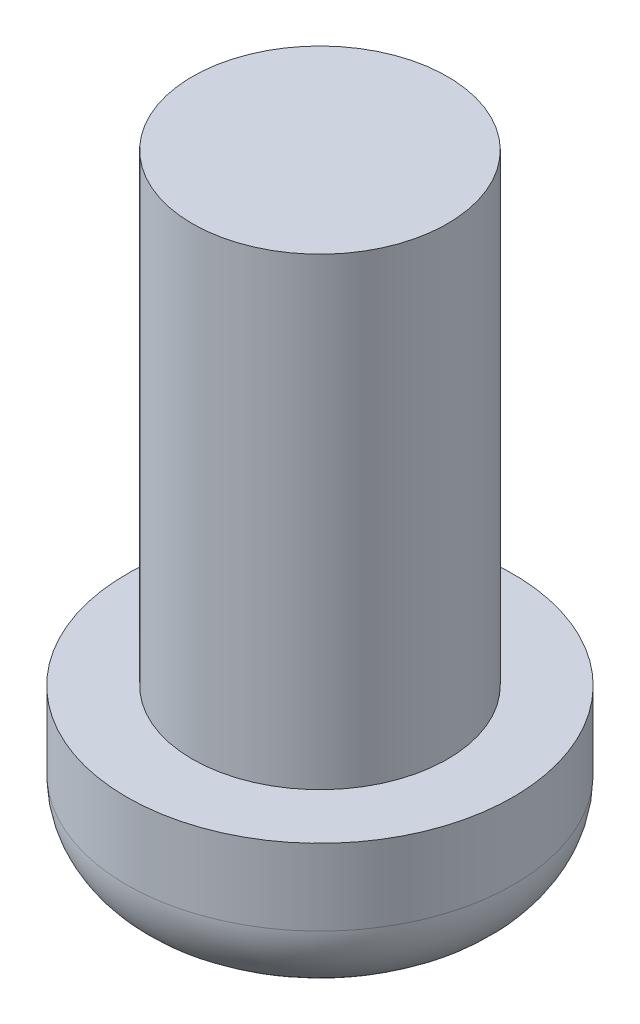
ISO-10303-21;
HEADER;
FILE_DESCRIPTION(('STEP AP214'),'2;1');
FILE_NAME('part.step','',(''),(''),'','','');
FILE_SCHEMA(('AUTOMOTIVE_DESIGN { 1 0 10303 214 1 1 1 1 }'));
ENDSEC;
DATA;
#1=APPLICATION_CONTEXT('core data for automotive mechanical design processes');
#2=APPLICATION_PROTOCOL_DEFINITION('international standard','automotive_design',2000,#1);
#3=PRODUCT_CONTEXT('',#1,'mechanical');
#4=PRODUCT('Part','Part','',(#3));
#5=PRODUCT_RELATED_PRODUCT_CATEGORY('part','',(#4));
#6=PRODUCT_DEFINITION_FORMATION('','',#4);
#7=PRODUCT_DEFINITION_CONTEXT('part definition',#1,'design');
#8=PRODUCT_DEFINITION('design','',#6,#7);
#9=PRODUCT_DEFINITION_SHAPE('','',#8);
#10=(LENGTH_UNIT() NAMED_UNIT(*) SI_UNIT(.MILLI.,.METRE.));
#11=(NAMED_UNIT(*) PLANE_ANGLE_UNIT() SI_UNIT($,.RADIAN.));
#12=(NAMED_UNIT(*) SI_UNIT($,.STERADIAN.) SOLID_ANGLE_UNIT());
#13=UNCERTAINTY_MEASURE_WITH_UNIT(LENGTH_MEASURE(1.E-05),#10,'distance_accuracy_value','');
#14=(GEOMETRIC_REPRESENTATION_CONTEXT(3) GLOBAL_UNCERTAINTY_ASSIGNED_CONTEXT((#13)) GLOBAL_UNIT_ASSIGNED_CONTEXT((#10,
#11,#12)) REPRESENTATION_CONTEXT('',''));
#15=CARTESIAN_POINT('',(0.,0.,0.));
#16=DIRECTION('',(0.,0.,1.));
#17=DIRECTION('',(1.,0.,0.));
#18=AXIS2_PLACEMENT_3D('',#15,#16,#17);
#19=CARTESIAN_POINT('',(0.,2.,0.));
#20=DIRECTION('',(0.,-1.,0.));
#21=DIRECTION('',(0.,0.,-1.));
#22=AXIS2_PLACEMENT_3D('',#19,#20,#21);
#23=CYLINDRICAL_SURFACE('',#22,2.5);
#24=CARTESIAN_POINT('',(0.,1.016,0.));
#25=DIRECTION('',(0.,1.,0.));
#26=DIRECTION('',(0.,0.,1.));
#27=AXIS2_PLACEMENT_3D('',#24,#25,#26);
#28=CIRCLE('',#27,2.5);
#29=CARTESIAN_POINT('',(0.,1.016,2.5));
#30=VERTEX_POINT('',#29);
#31=EDGE_CURVE('E44',#30,#30,#28,.T.);
#32=ORIENTED_EDGE('',*,*,#31,.T.);
#33=EDGE_LOOP('',(#32));
#34=FACE_BOUND('',#33,.T.);
#35=CARTESIAN_POINT('',(0.,2.,0.));
#36=DIRECTION('',(0.,1.,0.));
#37=DIRECTION('',(0.,0.,1.));
#38=AXIS2_PLACEMENT_3D('',#35,#36,#37);
#39=CIRCLE('',#38,2.5);
#40=CARTESIAN_POINT('',(0.,2.,2.5));
#41=VERTEX_POINT('',#40);
#42=EDGE_CURVE('E54',#41,#41,#39,.T.);
#43=ORIENTED_EDGE('',*,*,#42,.F.);
#44=EDGE_LOOP('',(#43));
#45=FACE_BOUND('',#44,.T.);
#46=ADVANCED_FACE('F36',(#34,#45),#23,.T.);
#47=CARTESIAN_POINT('',(0.,2.,0.));
#48=DIRECTION('',(0.,1.,0.));
#49=DIRECTION('',(0.,0.,1.));
#50=AXIS2_PLACEMENT_3D('',#47,#48,#49);
#51=PLANE('',#50);
#52=CARTESIAN_POINT('',(0.,2.,0.));
#53=DIRECTION('',(0.,1.,0.));
#54=DIRECTION('',(0.,0.,1.));
#55=AXIS2_PLACEMENT_3D('',#52,#53,#54);
#56=CIRCLE('',#55,1.65);
#57=CARTESIAN_POINT('',(0.,2.,1.65));
#58=VERTEX_POINT('',#57);
#59=EDGE_CURVE('E49',#58,#58,#56,.T.);
#60=ORIENTED_EDGE('',*,*,#59,.F.);
#61=EDGE_LOOP('',(#60));
#62=FACE_BOUND('',#61,.T.);
#63=ORIENTED_EDGE('',*,*,#42,.T.);
#64=EDGE_LOOP('',(#63));
#65=FACE_BOUND('',#64,.T.);
#66=ADVANCED_FACE('F74',(#62,#65),#51,.T.);
#67=CARTESIAN_POINT('',(0.,0.,0.));
#68=DIRECTION('',(0.,1.,0.));
#69=DIRECTION('',(0.,0.,1.));
#70=AXIS2_PLACEMENT_3D('',#67,#68,#69);
#71=PLANE('',#70);
#72=CARTESIAN_POINT('',(0.,0.,0.));
#73=DIRECTION('',(0.,1.,0.));
#74=DIRECTION('',(0.,0.,1.));
#75=AXIS2_PLACEMENT_3D('',#72,#73,#74);
#76=CIRCLE('',#75,1.484);
#77=CARTESIAN_POINT('',(0.,0.,1.484));
#78=VERTEX_POINT('',#77);
#79=EDGE_CURVE('E10',#78,#78,#76,.F.);
#80=ORIENTED_EDGE('',*,*,#79,.T.);
#81=EDGE_LOOP('',(#80));
#82=FACE_BOUND('',#81,.T.);
#83=ADVANCED_FACE('F70',(#82),#71,.F.);
#84=CARTESIAN_POINT('',(0.,8.,0.));
#85=DIRECTION('',(0.,-1.,0.));
#86=DIRECTION('',(0.,0.,-1.));
#87=AXIS2_PLACEMENT_3D('',#84,#85,#86);
#88=CYLINDRICAL_SURFACE('',#87,1.65);
#89=CARTESIAN_POINT('',(0.,8.,0.));
#90=DIRECTION('',(0.,1.,0.));
#91=DIRECTION('',(0.,0.,1.));
#92=AXIS2_PLACEMENT_3D('',#89,#90,#91);
#93=CIRCLE('',#92,1.65);
#94=CARTESIAN_POINT('',(0.,8.,1.65));
#95=VERTEX_POINT('',#94);
#96=EDGE_CURVE('E59',#95,#95,#93,.T.);
#97=ORIENTED_EDGE('',*,*,#96,.F.);
#98=EDGE_LOOP('',(#97));
#99=FACE_BOUND('',#98,.T.);
#100=ORIENTED_EDGE('',*,*,#59,.T.);
#101=EDGE_LOOP('',(#100));
#102=FACE_BOUND('',#101,.T.);
#103=ADVANCED_FACE('F67',(#99,#102),#88,.T.);
#104=CARTESIAN_POINT('',(0.,8.,0.));
#105=DIRECTION('',(0.,1.,0.));
#106=DIRECTION('',(0.,0.,1.));
#107=AXIS2_PLACEMENT_3D('',#104,#105,#106);
#108=PLANE('',#107);
#109=ORIENTED_EDGE('',*,*,#96,.T.);
#110=EDGE_LOOP('',(#109));
#111=FACE_BOUND('',#110,.T.);
#112=ADVANCED_FACE('F65',(#111),#108,.T.);
#113=CARTESIAN_POINT('',(0.,1.016,0.));
#114=DIRECTION('',(0.,1.,0.));
#115=DIRECTION('',(0.,0.,1.));
#116=AXIS2_PLACEMENT_3D('',#113,#114,#115);
#117=TOROIDAL_SURFACE('',#116,1.484,1.016);
#118=ORIENTED_EDGE('',*,*,#79,.F.);
#119=EDGE_LOOP('',(#118));
#120=FACE_BOUND('',#119,.T.);
#121=ORIENTED_EDGE('',*,*,#31,.F.);
#122=EDGE_LOOP('',(#121));
#123=FACE_BOUND('',#122,.T.);
#124=ADVANCED_FACE('F38',(#120,#123),#117,.T.);
#125=CLOSED_SHELL('',(#46,#66,#83,#103,#112,#124));
#126=MANIFOLD_SOLID_BREP('B2',#125);
#127=ADVANCED_BREP_SHAPE_REPRESENTATION('',(#18,#126),#14);
#128=SHAPE_DEFINITION_REPRESENTATION(#9,#127);
ENDSEC;
END-ISO-10303-21;
